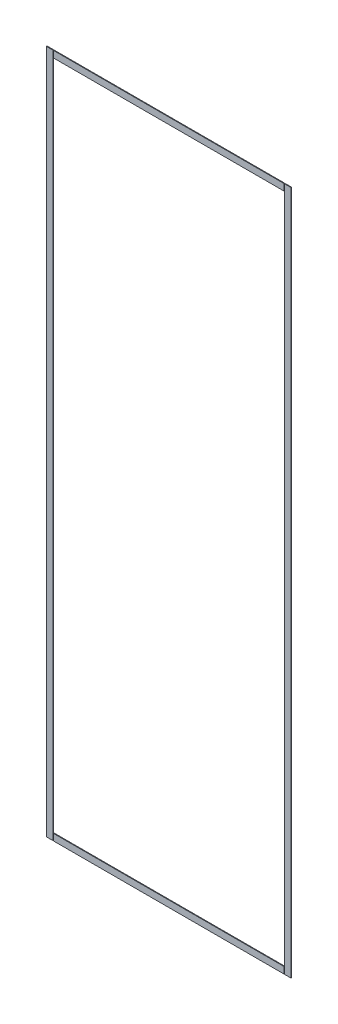
ISO-10303-21;
HEADER;
FILE_DESCRIPTION(('STEP AP214'),'2;1');
FILE_NAME('part.step','',(''),(''),'','','');
FILE_SCHEMA(('AUTOMOTIVE_DESIGN { 1 0 10303 214 1 1 1 1 }'));
ENDSEC;
DATA;
#1=APPLICATION_CONTEXT('core data for automotive mechanical design processes');
#2=APPLICATION_PROTOCOL_DEFINITION('international standard','automotive_design',2000,#1);
#3=PRODUCT_CONTEXT('',#1,'mechanical');
#4=PRODUCT('Part','Part','',(#3));
#5=PRODUCT_RELATED_PRODUCT_CATEGORY('part','',(#4));
#6=PRODUCT_DEFINITION_FORMATION('','',#4);
#7=PRODUCT_DEFINITION_CONTEXT('part definition',#1,'design');
#8=PRODUCT_DEFINITION('design','',#6,#7);
#9=PRODUCT_DEFINITION_SHAPE('','',#8);
#10=(LENGTH_UNIT() NAMED_UNIT(*) SI_UNIT(.MILLI.,.METRE.));
#11=(NAMED_UNIT(*) PLANE_ANGLE_UNIT() SI_UNIT($,.RADIAN.));
#12=(NAMED_UNIT(*) SI_UNIT($,.STERADIAN.) SOLID_ANGLE_UNIT());
#13=UNCERTAINTY_MEASURE_WITH_UNIT(LENGTH_MEASURE(1.E-05),#10,'distance_accuracy_value','');
#14=(GEOMETRIC_REPRESENTATION_CONTEXT(3) GLOBAL_UNCERTAINTY_ASSIGNED_CONTEXT((#13)) GLOBAL_UNIT_ASSIGNED_CONTEXT((#10,
#11,#12)) REPRESENTATION_CONTEXT('',''));
#15=CARTESIAN_POINT('',(0.,0.,0.));
#16=DIRECTION('',(0.,0.,1.));
#17=DIRECTION('',(1.,0.,0.));
#18=AXIS2_PLACEMENT_3D('',#15,#16,#17);
#19=CARTESIAN_POINT('',(0.,0.,-1.));
#20=DIRECTION('',(0.,0.,-1.));
#21=DIRECTION('',(-1.,0.,0.));
#22=AXIS2_PLACEMENT_3D('',#19,#20,#21);
#23=PLANE('',#22);
#24=DIRECTION('',(0.,1.,0.));
#25=VECTOR('',#24,1.);
#26=CARTESIAN_POINT('',(-352.,-1110.,-1.));
#27=LINE('',#26,#25);
#28=CARTESIAN_POINT('',(-352.,-1110.,-1.));
#29=VERTEX_POINT('',#28);
#30=CARTESIAN_POINT('',(-352.,-1090.,-1.));
#31=VERTEX_POINT('',#30);
#32=EDGE_CURVE('E56',#29,#31,#27,.T.);
#33=ORIENTED_EDGE('',*,*,#32,.T.);
#34=DIRECTION('',(1.,0.,0.));
#35=VECTOR('',#34,1.);
#36=CARTESIAN_POINT('',(-352.,-1090.,-1.));
#37=LINE('',#36,#35);
#38=CARTESIAN_POINT('',(352.,-1090.,-1.));
#39=VERTEX_POINT('',#38);
#40=EDGE_CURVE('E95',#31,#39,#37,.T.);
#41=ORIENTED_EDGE('',*,*,#40,.T.);
#42=DIRECTION('',(0.,-1.,0.));
#43=VECTOR('',#42,1.);
#44=CARTESIAN_POINT('',(352.,-1110.,-1.));
#45=LINE('',#44,#43);
#46=CARTESIAN_POINT('',(352.,-1110.,-1.));
#47=VERTEX_POINT('',#46);
#48=EDGE_CURVE('E90',#39,#47,#45,.T.);
#49=ORIENTED_EDGE('',*,*,#48,.T.);
#50=DIRECTION('',(1.,0.,0.));
#51=VECTOR('',#50,1.);
#52=CARTESIAN_POINT('',(-352.,-1110.,-1.));
#53=LINE('',#52,#51);
#54=EDGE_CURVE('E106',#47,#29,#53,.F.);
#55=ORIENTED_EDGE('',*,*,#54,.T.);
#56=EDGE_LOOP('',(#33,#41,#49,#55));
#57=FACE_BOUND('',#56,.T.);
#58=ADVANCED_FACE('F53',(#57),#23,.T.);
#59=CARTESIAN_POINT('',(-352.,-1110.,1.));
#60=DIRECTION('',(1.,0.,0.));
#61=DIRECTION('',(0.,1.,0.));
#62=AXIS2_PLACEMENT_3D('',#59,#60,#61);
#63=PLANE('',#62);
#64=DIRECTION('',(0.,1.,0.));
#65=VECTOR('',#64,1.);
#66=CARTESIAN_POINT('',(-352.,0.,1.));
#67=LINE('',#66,#65);
#68=CARTESIAN_POINT('',(-352.,-1110.,1.));
#69=VERTEX_POINT('',#68);
#70=CARTESIAN_POINT('',(-352.,-1090.,1.));
#71=VERTEX_POINT('',#70);
#72=EDGE_CURVE('E113',#69,#71,#67,.T.);
#73=ORIENTED_EDGE('',*,*,#72,.T.);
#74=DIRECTION('',(0.,0.,-1.));
#75=VECTOR('',#74,1.);
#76=CARTESIAN_POINT('',(-352.,-1090.,1.));
#77=LINE('',#76,#75);
#78=EDGE_CURVE('E100',#71,#31,#77,.T.);
#79=ORIENTED_EDGE('',*,*,#78,.T.);
#80=ORIENTED_EDGE('',*,*,#32,.F.);
#81=DIRECTION('',(0.,0.,1.));
#82=VECTOR('',#81,1.);
#83=CARTESIAN_POINT('',(-352.,-1110.,1.));
#84=LINE('',#83,#82);
#85=EDGE_CURVE('E123',#29,#69,#84,.T.);
#86=ORIENTED_EDGE('',*,*,#85,.T.);
#87=EDGE_LOOP('',(#73,#79,#80,#86));
#88=FACE_BOUND('',#87,.T.);
#89=ADVANCED_FACE('F112',(#88),#63,.F.);
#90=CARTESIAN_POINT('',(-352.,-1090.,1.));
#91=DIRECTION('',(0.,-1.,0.));
#92=DIRECTION('',(0.,0.,-1.));
#93=AXIS2_PLACEMENT_3D('',#90,#91,#92);
#94=PLANE('',#93);
#95=DIRECTION('',(-1.,0.,0.));
#96=VECTOR('',#95,1.);
#97=CARTESIAN_POINT('',(0.,-1090.,1.));
#98=LINE('',#97,#96);
#99=CARTESIAN_POINT('',(352.,-1090.,1.));
#100=VERTEX_POINT('',#99);
#101=EDGE_CURVE('E130',#71,#100,#98,.F.);
#102=ORIENTED_EDGE('',*,*,#101,.T.);
#103=DIRECTION('',(0.,0.,1.));
#104=VECTOR('',#103,1.);
#105=CARTESIAN_POINT('',(352.,-1090.,1.));
#106=LINE('',#105,#104);
#107=EDGE_CURVE('E102',#100,#39,#106,.F.);
#108=ORIENTED_EDGE('',*,*,#107,.T.);
#109=ORIENTED_EDGE('',*,*,#40,.F.);
#110=ORIENTED_EDGE('',*,*,#78,.F.);
#111=EDGE_LOOP('',(#102,#108,#109,#110));
#112=FACE_BOUND('',#111,.T.);
#113=ADVANCED_FACE('F98',(#112),#94,.F.);
#114=CARTESIAN_POINT('',(352.,-1110.,1.));
#115=DIRECTION('',(-1.,0.,0.));
#116=DIRECTION('',(0.,-1.,0.));
#117=AXIS2_PLACEMENT_3D('',#114,#115,#116);
#118=PLANE('',#117);
#119=DIRECTION('',(0.,1.,0.));
#120=VECTOR('',#119,1.);
#121=CARTESIAN_POINT('',(352.,0.,1.));
#122=LINE('',#121,#120);
#123=CARTESIAN_POINT('',(352.,-1110.,1.));
#124=VERTEX_POINT('',#123);
#125=EDGE_CURVE('E63',#100,#124,#122,.F.);
#126=ORIENTED_EDGE('',*,*,#125,.T.);
#127=DIRECTION('',(0.,0.,1.));
#128=VECTOR('',#127,1.);
#129=CARTESIAN_POINT('',(352.,-1110.,1.));
#130=LINE('',#129,#128);
#131=EDGE_CURVE('E71',#124,#47,#130,.F.);
#132=ORIENTED_EDGE('',*,*,#131,.T.);
#133=ORIENTED_EDGE('',*,*,#48,.F.);
#134=ORIENTED_EDGE('',*,*,#107,.F.);
#135=EDGE_LOOP('',(#126,#132,#133,#134));
#136=FACE_BOUND('',#135,.T.);
#137=ADVANCED_FACE('F136',(#136),#118,.F.);
#138=CARTESIAN_POINT('',(-352.,-1110.,1.));
#139=DIRECTION('',(0.,1.,0.));
#140=DIRECTION('',(0.,0.,1.));
#141=AXIS2_PLACEMENT_3D('',#138,#139,#140);
#142=PLANE('',#141);
#143=DIRECTION('',(-1.,0.,0.));
#144=VECTOR('',#143,1.);
#145=CARTESIAN_POINT('',(0.,-1110.,1.));
#146=LINE('',#145,#144);
#147=EDGE_CURVE('E12',#124,#69,#146,.T.);
#148=ORIENTED_EDGE('',*,*,#147,.T.);
#149=ORIENTED_EDGE('',*,*,#85,.F.);
#150=ORIENTED_EDGE('',*,*,#54,.F.);
#151=ORIENTED_EDGE('',*,*,#131,.F.);
#152=EDGE_LOOP('',(#148,#149,#150,#151));
#153=FACE_BOUND('',#152,.T.);
#154=ADVANCED_FACE('F139',(#153),#142,.F.);
#155=CARTESIAN_POINT('',(0.,0.,1.));
#156=DIRECTION('',(0.,0.,-1.));
#157=DIRECTION('',(-1.,0.,0.));
#158=AXIS2_PLACEMENT_3D('',#155,#156,#157);
#159=PLANE('',#158);
#160=ORIENTED_EDGE('',*,*,#125,.F.);
#161=ORIENTED_EDGE('',*,*,#101,.F.);
#162=ORIENTED_EDGE('',*,*,#72,.F.);
#163=ORIENTED_EDGE('',*,*,#147,.F.);
#164=EDGE_LOOP('',(#160,#161,#162,#163));
#165=FACE_BOUND('',#164,.T.);
#166=ADVANCED_FACE('F138',(#165),#159,.F.);
#167=CLOSED_SHELL('',(#58,#89,#113,#137,#154,#166));
#168=MANIFOLD_SOLID_BREP('B2',#167);
#169=CARTESIAN_POINT('',(0.,0.,-1.));
#170=DIRECTION('',(0.,0.,1.));
#171=DIRECTION('',(1.,0.,0.));
#172=AXIS2_PLACEMENT_3D('',#169,#170,#171);
#173=PLANE('',#172);
#174=DIRECTION('',(0.,-1.,0.));
#175=VECTOR('',#174,1.);
#176=CARTESIAN_POINT('',(352.,980.,-1.));
#177=LINE('',#176,#175);
#178=CARTESIAN_POINT('',(352.,980.,-1.));
#179=VERTEX_POINT('',#178);
#180=CARTESIAN_POINT('',(352.,960.000000000001,-1.));
#181=VERTEX_POINT('',#180);
#182=EDGE_CURVE('E229',#179,#181,#177,.T.);
#183=ORIENTED_EDGE('',*,*,#182,.T.);
#184=DIRECTION('',(1.,0.,0.));
#185=VECTOR('',#184,1.);
#186=CARTESIAN_POINT('',(-352.,960.000000000001,-1.));
#187=LINE('',#186,#185);
#188=CARTESIAN_POINT('',(-352.,960.000000000001,-1.));
#189=VERTEX_POINT('',#188);
#190=EDGE_CURVE('E288',#181,#189,#187,.F.);
#191=ORIENTED_EDGE('',*,*,#190,.T.);
#192=DIRECTION('',(0.,1.,0.));
#193=VECTOR('',#192,1.);
#194=CARTESIAN_POINT('',(-352.,980.,-1.));
#195=LINE('',#194,#193);
#196=CARTESIAN_POINT('',(-352.,980.,-1.));
#197=VERTEX_POINT('',#196);
#198=EDGE_CURVE('E264',#189,#197,#195,.T.);
#199=ORIENTED_EDGE('',*,*,#198,.T.);
#200=DIRECTION('',(1.,0.,0.));
#201=VECTOR('',#200,1.);
#202=CARTESIAN_POINT('',(-352.,980.,-1.));
#203=LINE('',#202,#201);
#204=EDGE_CURVE('E266',#197,#179,#203,.T.);
#205=ORIENTED_EDGE('',*,*,#204,.T.);
#206=EDGE_LOOP('',(#183,#191,#199,#205));
#207=FACE_BOUND('',#206,.T.);
#208=ADVANCED_FACE('F226',(#207),#173,.F.);
#209=CARTESIAN_POINT('',(352.,980.,1.));
#210=DIRECTION('',(-1.,0.,0.));
#211=DIRECTION('',(0.,-1.,0.));
#212=AXIS2_PLACEMENT_3D('',#209,#210,#211);
#213=PLANE('',#212);
#214=DIRECTION('',(0.,1.,0.));
#215=VECTOR('',#214,1.);
#216=CARTESIAN_POINT('',(352.,0.,1.));
#217=LINE('',#216,#215);
#218=CARTESIAN_POINT('',(352.,960.000000000001,1.));
#219=VERTEX_POINT('',#218);
#220=CARTESIAN_POINT('',(352.,980.,1.));
#221=VERTEX_POINT('',#220);
#222=EDGE_CURVE('E292',#219,#221,#217,.T.);
#223=ORIENTED_EDGE('',*,*,#222,.F.);
#224=DIRECTION('',(0.,0.,1.));
#225=VECTOR('',#224,1.);
#226=CARTESIAN_POINT('',(352.,960.000000000001,1.));
#227=LINE('',#226,#225);
#228=EDGE_CURVE('E277',#219,#181,#227,.F.);
#229=ORIENTED_EDGE('',*,*,#228,.T.);
#230=ORIENTED_EDGE('',*,*,#182,.F.);
#231=DIRECTION('',(0.,0.,-1.));
#232=VECTOR('',#231,1.);
#233=CARTESIAN_POINT('',(352.,980.,1.));
#234=LINE('',#233,#232);
#235=EDGE_CURVE('E272',#179,#221,#234,.F.);
#236=ORIENTED_EDGE('',*,*,#235,.T.);
#237=EDGE_LOOP('',(#223,#229,#230,#236));
#238=FACE_BOUND('',#237,.T.);
#239=ADVANCED_FACE('F274',(#238),#213,.F.);
#240=CARTESIAN_POINT('',(-352.,980.,1.));
#241=DIRECTION('',(0.,-1.,0.));
#242=DIRECTION('',(0.,0.,-1.));
#243=AXIS2_PLACEMENT_3D('',#240,#241,#242);
#244=PLANE('',#243);
#245=DIRECTION('',(1.,0.,0.));
#246=VECTOR('',#245,1.);
#247=CARTESIAN_POINT('',(0.,980.,1.));
#248=LINE('',#247,#246);
#249=CARTESIAN_POINT('',(-352.,980.,1.));
#250=VERTEX_POINT('',#249);
#251=EDGE_CURVE('E281',#221,#250,#248,.F.);
#252=ORIENTED_EDGE('',*,*,#251,.F.);
#253=ORIENTED_EDGE('',*,*,#235,.F.);
#254=ORIENTED_EDGE('',*,*,#204,.F.);
#255=DIRECTION('',(0.,0.,1.));
#256=VECTOR('',#255,1.);
#257=CARTESIAN_POINT('',(-352.,980.,1.));
#258=LINE('',#257,#256);
#259=EDGE_CURVE('E284',#197,#250,#258,.T.);
#260=ORIENTED_EDGE('',*,*,#259,.T.);
#261=EDGE_LOOP('',(#252,#253,#254,#260));
#262=FACE_BOUND('',#261,.T.);
#263=ADVANCED_FACE('F279',(#262),#244,.F.);
#264=CARTESIAN_POINT('',(-352.,980.,1.));
#265=DIRECTION('',(1.,0.,0.));
#266=DIRECTION('',(0.,1.,0.));
#267=AXIS2_PLACEMENT_3D('',#264,#265,#266);
#268=PLANE('',#267);
#269=DIRECTION('',(0.,1.,0.));
#270=VECTOR('',#269,1.);
#271=CARTESIAN_POINT('',(-352.,0.,1.));
#272=LINE('',#271,#270);
#273=CARTESIAN_POINT('',(-352.,960.000000000001,1.));
#274=VERTEX_POINT('',#273);
#275=EDGE_CURVE('E235',#250,#274,#272,.F.);
#276=ORIENTED_EDGE('',*,*,#275,.F.);
#277=ORIENTED_EDGE('',*,*,#259,.F.);
#278=ORIENTED_EDGE('',*,*,#198,.F.);
#279=DIRECTION('',(0.,0.,1.));
#280=VECTOR('',#279,1.);
#281=CARTESIAN_POINT('',(-352.,960.000000000001,1.));
#282=LINE('',#281,#280);
#283=EDGE_CURVE('E244',#189,#274,#282,.T.);
#284=ORIENTED_EDGE('',*,*,#283,.T.);
#285=EDGE_LOOP('',(#276,#277,#278,#284));
#286=FACE_BOUND('',#285,.T.);
#287=ADVANCED_FACE('F298',(#286),#268,.F.);
#288=CARTESIAN_POINT('',(-352.,960.000000000001,1.));
#289=DIRECTION('',(0.,1.,0.));
#290=DIRECTION('',(0.,0.,1.));
#291=AXIS2_PLACEMENT_3D('',#288,#289,#290);
#292=PLANE('',#291);
#293=DIRECTION('',(1.,0.,0.));
#294=VECTOR('',#293,1.);
#295=CARTESIAN_POINT('',(0.,960.000000000001,1.));
#296=LINE('',#295,#294);
#297=EDGE_CURVE('E51',#274,#219,#296,.T.);
#298=ORIENTED_EDGE('',*,*,#297,.F.);
#299=ORIENTED_EDGE('',*,*,#283,.F.);
#300=ORIENTED_EDGE('',*,*,#190,.F.);
#301=ORIENTED_EDGE('',*,*,#228,.F.);
#302=EDGE_LOOP('',(#298,#299,#300,#301));
#303=FACE_BOUND('',#302,.T.);
#304=ADVANCED_FACE('F300',(#303),#292,.F.);
#305=CARTESIAN_POINT('',(0.,0.,1.));
#306=DIRECTION('',(0.,0.,1.));
#307=DIRECTION('',(1.,0.,0.));
#308=AXIS2_PLACEMENT_3D('',#305,#306,#307);
#309=PLANE('',#308);
#310=ORIENTED_EDGE('',*,*,#275,.T.);
#311=ORIENTED_EDGE('',*,*,#297,.T.);
#312=ORIENTED_EDGE('',*,*,#222,.T.);
#313=ORIENTED_EDGE('',*,*,#251,.T.);
#314=EDGE_LOOP('',(#310,#311,#312,#313));
#315=FACE_BOUND('',#314,.T.);
#316=ADVANCED_FACE('F297',(#315),#309,.T.);
#317=CLOSED_SHELL('',(#208,#239,#263,#287,#304,#316));
#318=MANIFOLD_SOLID_BREP('B6',#317);
#319=CARTESIAN_POINT('',(0.,0.,-1.));
#320=DIRECTION('',(0.,0.,1.));
#321=DIRECTION('',(1.,0.,0.));
#322=AXIS2_PLACEMENT_3D('',#319,#320,#321);
#323=PLANE('',#322);
#324=DIRECTION('',(0.,1.,0.));
#325=VECTOR('',#324,1.);
#326=CARTESIAN_POINT('',(353.,980.,-1.));
#327=LINE('',#326,#325);
#328=CARTESIAN_POINT('',(353.,-1110.,-1.));
#329=VERTEX_POINT('',#328);
#330=CARTESIAN_POINT('',(353.,980.,-1.));
#331=VERTEX_POINT('',#330);
#332=EDGE_CURVE('E387',#329,#331,#327,.T.);
#333=ORIENTED_EDGE('',*,*,#332,.T.);
#334=DIRECTION('',(1.,0.,0.));
#335=VECTOR('',#334,1.);
#336=CARTESIAN_POINT('',(353.,980.,-1.));
#337=LINE('',#336,#335);
#338=CARTESIAN_POINT('',(373.,980.,-1.));
#339=VERTEX_POINT('',#338);
#340=EDGE_CURVE('E446',#331,#339,#337,.T.);
#341=ORIENTED_EDGE('',*,*,#340,.T.);
#342=DIRECTION('',(0.,-1.,0.));
#343=VECTOR('',#342,1.);
#344=CARTESIAN_POINT('',(373.,980.,-1.));
#345=LINE('',#344,#343);
#346=CARTESIAN_POINT('',(373.,-1110.,-1.));
#347=VERTEX_POINT('',#346);
#348=EDGE_CURVE('E422',#339,#347,#345,.T.);
#349=ORIENTED_EDGE('',*,*,#348,.T.);
#350=DIRECTION('',(1.,0.,0.));
#351=VECTOR('',#350,1.);
#352=CARTESIAN_POINT('',(353.,-1110.,-1.));
#353=LINE('',#352,#351);
#354=EDGE_CURVE('E424',#347,#329,#353,.F.);
#355=ORIENTED_EDGE('',*,*,#354,.T.);
#356=EDGE_LOOP('',(#333,#341,#349,#355));
#357=FACE_BOUND('',#356,.T.);
#358=ADVANCED_FACE('F384',(#357),#323,.F.);
#359=CARTESIAN_POINT('',(353.,980.,1.));
#360=DIRECTION('',(1.,0.,0.));
#361=DIRECTION('',(0.,1.,0.));
#362=AXIS2_PLACEMENT_3D('',#359,#360,#361);
#363=PLANE('',#362);
#364=DIRECTION('',(0.,1.,0.));
#365=VECTOR('',#364,1.);
#366=CARTESIAN_POINT('',(353.,0.,1.));
#367=LINE('',#366,#365);
#368=CARTESIAN_POINT('',(353.,980.,1.));
#369=VERTEX_POINT('',#368);
#370=CARTESIAN_POINT('',(353.,-1110.,1.));
#371=VERTEX_POINT('',#370);
#372=EDGE_CURVE('E450',#369,#371,#367,.F.);
#373=ORIENTED_EDGE('',*,*,#372,.F.);
#374=DIRECTION('',(0.,0.,-1.));
#375=VECTOR('',#374,1.);
#376=CARTESIAN_POINT('',(353.,980.,1.));
#377=LINE('',#376,#375);
#378=EDGE_CURVE('E435',#369,#331,#377,.T.);
#379=ORIENTED_EDGE('',*,*,#378,.T.);
#380=ORIENTED_EDGE('',*,*,#332,.F.);
#381=DIRECTION('',(0.,0.,1.));
#382=VECTOR('',#381,1.);
#383=CARTESIAN_POINT('',(353.,-1110.,1.));
#384=LINE('',#383,#382);
#385=EDGE_CURVE('E430',#329,#371,#384,.T.);
#386=ORIENTED_EDGE('',*,*,#385,.T.);
#387=EDGE_LOOP('',(#373,#379,#380,#386));
#388=FACE_BOUND('',#387,.T.);
#389=ADVANCED_FACE('F432',(#388),#363,.F.);
#390=CARTESIAN_POINT('',(353.,-1110.,1.));
#391=DIRECTION('',(0.,1.,0.));
#392=DIRECTION('',(0.,0.,1.));
#393=AXIS2_PLACEMENT_3D('',#390,#391,#392);
#394=PLANE('',#393);
#395=DIRECTION('',(1.,0.,0.));
#396=VECTOR('',#395,1.);
#397=CARTESIAN_POINT('',(0.,-1110.,1.));
#398=LINE('',#397,#396);
#399=CARTESIAN_POINT('',(373.,-1110.,1.));
#400=VERTEX_POINT('',#399);
#401=EDGE_CURVE('E439',#371,#400,#398,.T.);
#402=ORIENTED_EDGE('',*,*,#401,.F.);
#403=ORIENTED_EDGE('',*,*,#385,.F.);
#404=ORIENTED_EDGE('',*,*,#354,.F.);
#405=DIRECTION('',(0.,0.,1.));
#406=VECTOR('',#405,1.);
#407=CARTESIAN_POINT('',(373.,-1110.,1.));
#408=LINE('',#407,#406);
#409=EDGE_CURVE('E442',#347,#400,#408,.T.);
#410=ORIENTED_EDGE('',*,*,#409,.T.);
#411=EDGE_LOOP('',(#402,#403,#404,#410));
#412=FACE_BOUND('',#411,.T.);
#413=ADVANCED_FACE('F437',(#412),#394,.F.);
#414=CARTESIAN_POINT('',(373.,980.,1.));
#415=DIRECTION('',(-1.,0.,0.));
#416=DIRECTION('',(0.,-1.,0.));
#417=AXIS2_PLACEMENT_3D('',#414,#415,#416);
#418=PLANE('',#417);
#419=DIRECTION('',(0.,1.,0.));
#420=VECTOR('',#419,1.);
#421=CARTESIAN_POINT('',(373.,0.,1.));
#422=LINE('',#421,#420);
#423=CARTESIAN_POINT('',(373.,980.,1.));
#424=VERTEX_POINT('',#423);
#425=EDGE_CURVE('E393',#400,#424,#422,.T.);
#426=ORIENTED_EDGE('',*,*,#425,.F.);
#427=ORIENTED_EDGE('',*,*,#409,.F.);
#428=ORIENTED_EDGE('',*,*,#348,.F.);
#429=DIRECTION('',(0.,0.,-1.));
#430=VECTOR('',#429,1.);
#431=CARTESIAN_POINT('',(373.,980.,1.));
#432=LINE('',#431,#430);
#433=EDGE_CURVE('E402',#339,#424,#432,.F.);
#434=ORIENTED_EDGE('',*,*,#433,.T.);
#435=EDGE_LOOP('',(#426,#427,#428,#434));
#436=FACE_BOUND('',#435,.T.);
#437=ADVANCED_FACE('F456',(#436),#418,.F.);
#438=CARTESIAN_POINT('',(353.,980.,1.));
#439=DIRECTION('',(0.,-1.,0.));
#440=DIRECTION('',(0.,0.,-1.));
#441=AXIS2_PLACEMENT_3D('',#438,#439,#440);
#442=PLANE('',#441);
#443=DIRECTION('',(1.,0.,0.));
#444=VECTOR('',#443,1.);
#445=CARTESIAN_POINT('',(0.,980.,1.));
#446=LINE('',#445,#444);
#447=EDGE_CURVE('E224',#424,#369,#446,.F.);
#448=ORIENTED_EDGE('',*,*,#447,.F.);
#449=ORIENTED_EDGE('',*,*,#433,.F.);
#450=ORIENTED_EDGE('',*,*,#340,.F.);
#451=ORIENTED_EDGE('',*,*,#378,.F.);
#452=EDGE_LOOP('',(#448,#449,#450,#451));
#453=FACE_BOUND('',#452,.T.);
#454=ADVANCED_FACE('F458',(#453),#442,.F.);
#455=CARTESIAN_POINT('',(0.,0.,1.));
#456=DIRECTION('',(0.,0.,1.));
#457=DIRECTION('',(1.,0.,0.));
#458=AXIS2_PLACEMENT_3D('',#455,#456,#457);
#459=PLANE('',#458);
#460=ORIENTED_EDGE('',*,*,#425,.T.);
#461=ORIENTED_EDGE('',*,*,#447,.T.);
#462=ORIENTED_EDGE('',*,*,#372,.T.);
#463=ORIENTED_EDGE('',*,*,#401,.T.);
#464=EDGE_LOOP('',(#460,#461,#462,#463));
#465=FACE_BOUND('',#464,.T.);
#466=ADVANCED_FACE('F455',(#465),#459,.T.);
#467=CLOSED_SHELL('',(#358,#389,#413,#437,#454,#466));
#468=MANIFOLD_SOLID_BREP('B45',#467);
#469=CARTESIAN_POINT('',(0.,0.,-1.));
#470=DIRECTION('',(0.,0.,1.));
#471=DIRECTION('',(1.,0.,0.));
#472=AXIS2_PLACEMENT_3D('',#469,#470,#471);
#473=PLANE('',#472);
#474=DIRECTION('',(0.,1.,0.));
#475=VECTOR('',#474,1.);
#476=CARTESIAN_POINT('',(-373.,980.,-1.));
#477=LINE('',#476,#475);
#478=CARTESIAN_POINT('',(-373.,-1110.,-1.));
#479=VERTEX_POINT('',#478);
#480=CARTESIAN_POINT('',(-373.,980.,-1.));
#481=VERTEX_POINT('',#480);
#482=EDGE_CURVE('E536',#479,#481,#477,.T.);
#483=ORIENTED_EDGE('',*,*,#482,.T.);
#484=DIRECTION('',(1.,0.,0.));
#485=VECTOR('',#484,1.);
#486=CARTESIAN_POINT('',(-373.,980.,-1.));
#487=LINE('',#486,#485);
#488=CARTESIAN_POINT('',(-353.,980.,-1.));
#489=VERTEX_POINT('',#488);
#490=EDGE_CURVE('E595',#481,#489,#487,.T.);
#491=ORIENTED_EDGE('',*,*,#490,.T.);
#492=DIRECTION('',(0.,-1.,0.));
#493=VECTOR('',#492,1.);
#494=CARTESIAN_POINT('',(-353.,980.,-1.));
#495=LINE('',#494,#493);
#496=CARTESIAN_POINT('',(-353.,-1110.,-1.));
#497=VERTEX_POINT('',#496);
#498=EDGE_CURVE('E571',#489,#497,#495,.T.);
#499=ORIENTED_EDGE('',*,*,#498,.T.);
#500=DIRECTION('',(1.,0.,0.));
#501=VECTOR('',#500,1.);
#502=CARTESIAN_POINT('',(-373.,-1110.,-1.));
#503=LINE('',#502,#501);
#504=EDGE_CURVE('E573',#497,#479,#503,.F.);
#505=ORIENTED_EDGE('',*,*,#504,.T.);
#506=EDGE_LOOP('',(#483,#491,#499,#505));
#507=FACE_BOUND('',#506,.T.);
#508=ADVANCED_FACE('F533',(#507),#473,.F.);
#509=CARTESIAN_POINT('',(-373.,980.,1.));
#510=DIRECTION('',(1.,0.,0.));
#511=DIRECTION('',(0.,1.,0.));
#512=AXIS2_PLACEMENT_3D('',#509,#510,#511);
#513=PLANE('',#512);
#514=DIRECTION('',(0.,1.,0.));
#515=VECTOR('',#514,1.);
#516=CARTESIAN_POINT('',(-373.,0.,1.));
#517=LINE('',#516,#515);
#518=CARTESIAN_POINT('',(-373.,980.,1.));
#519=VERTEX_POINT('',#518);
#520=CARTESIAN_POINT('',(-373.,-1110.,1.));
#521=VERTEX_POINT('',#520);
#522=EDGE_CURVE('E599',#519,#521,#517,.F.);
#523=ORIENTED_EDGE('',*,*,#522,.F.);
#524=DIRECTION('',(0.,0.,-1.));
#525=VECTOR('',#524,1.);
#526=CARTESIAN_POINT('',(-373.,980.,1.));
#527=LINE('',#526,#525);
#528=EDGE_CURVE('E584',#519,#481,#527,.T.);
#529=ORIENTED_EDGE('',*,*,#528,.T.);
#530=ORIENTED_EDGE('',*,*,#482,.F.);
#531=DIRECTION('',(0.,0.,1.));
#532=VECTOR('',#531,1.);
#533=CARTESIAN_POINT('',(-373.,-1110.,1.));
#534=LINE('',#533,#532);
#535=EDGE_CURVE('E579',#479,#521,#534,.T.);
#536=ORIENTED_EDGE('',*,*,#535,.T.);
#537=EDGE_LOOP('',(#523,#529,#530,#536));
#538=FACE_BOUND('',#537,.T.);
#539=ADVANCED_FACE('F581',(#538),#513,.F.);
#540=CARTESIAN_POINT('',(-373.,-1110.,1.));
#541=DIRECTION('',(0.,1.,0.));
#542=DIRECTION('',(0.,0.,1.));
#543=AXIS2_PLACEMENT_3D('',#540,#541,#542);
#544=PLANE('',#543);
#545=DIRECTION('',(1.,0.,0.));
#546=VECTOR('',#545,1.);
#547=CARTESIAN_POINT('',(0.,-1110.,1.));
#548=LINE('',#547,#546);
#549=CARTESIAN_POINT('',(-353.,-1110.,1.));
#550=VERTEX_POINT('',#549);
#551=EDGE_CURVE('E588',#521,#550,#548,.T.);
#552=ORIENTED_EDGE('',*,*,#551,.F.);
#553=ORIENTED_EDGE('',*,*,#535,.F.);
#554=ORIENTED_EDGE('',*,*,#504,.F.);
#555=DIRECTION('',(0.,0.,1.));
#556=VECTOR('',#555,1.);
#557=CARTESIAN_POINT('',(-353.,-1110.,1.));
#558=LINE('',#557,#556);
#559=EDGE_CURVE('E591',#497,#550,#558,.T.);
#560=ORIENTED_EDGE('',*,*,#559,.T.);
#561=EDGE_LOOP('',(#552,#553,#554,#560));
#562=FACE_BOUND('',#561,.T.);
#563=ADVANCED_FACE('F586',(#562),#544,.F.);
#564=CARTESIAN_POINT('',(-353.,980.,1.));
#565=DIRECTION('',(-1.,0.,0.));
#566=DIRECTION('',(0.,-1.,0.));
#567=AXIS2_PLACEMENT_3D('',#564,#565,#566);
#568=PLANE('',#567);
#569=DIRECTION('',(0.,1.,0.));
#570=VECTOR('',#569,1.);
#571=CARTESIAN_POINT('',(-353.,0.,1.));
#572=LINE('',#571,#570);
#573=CARTESIAN_POINT('',(-353.,980.,1.));
#574=VERTEX_POINT('',#573);
#575=EDGE_CURVE('E542',#550,#574,#572,.T.);
#576=ORIENTED_EDGE('',*,*,#575,.F.);
#577=ORIENTED_EDGE('',*,*,#559,.F.);
#578=ORIENTED_EDGE('',*,*,#498,.F.);
#579=DIRECTION('',(0.,0.,-1.));
#580=VECTOR('',#579,1.);
#581=CARTESIAN_POINT('',(-353.,980.,1.));
#582=LINE('',#581,#580);
#583=EDGE_CURVE('E551',#489,#574,#582,.F.);
#584=ORIENTED_EDGE('',*,*,#583,.T.);
#585=EDGE_LOOP('',(#576,#577,#578,#584));
#586=FACE_BOUND('',#585,.T.);
#587=ADVANCED_FACE('F605',(#586),#568,.F.);
#588=CARTESIAN_POINT('',(-373.,980.,1.));
#589=DIRECTION('',(0.,-1.,0.));
#590=DIRECTION('',(0.,0.,-1.));
#591=AXIS2_PLACEMENT_3D('',#588,#589,#590);
#592=PLANE('',#591);
#593=DIRECTION('',(1.,0.,0.));
#594=VECTOR('',#593,1.);
#595=CARTESIAN_POINT('',(0.,980.,1.));
#596=LINE('',#595,#594);
#597=EDGE_CURVE('E382',#574,#519,#596,.F.);
#598=ORIENTED_EDGE('',*,*,#597,.F.);
#599=ORIENTED_EDGE('',*,*,#583,.F.);
#600=ORIENTED_EDGE('',*,*,#490,.F.);
#601=ORIENTED_EDGE('',*,*,#528,.F.);
#602=EDGE_LOOP('',(#598,#599,#600,#601));
#603=FACE_BOUND('',#602,.T.);
#604=ADVANCED_FACE('F607',(#603),#592,.F.);
#605=CARTESIAN_POINT('',(0.,0.,1.));
#606=DIRECTION('',(0.,0.,1.));
#607=DIRECTION('',(1.,0.,0.));
#608=AXIS2_PLACEMENT_3D('',#605,#606,#607);
#609=PLANE('',#608);
#610=ORIENTED_EDGE('',*,*,#575,.T.);
#611=ORIENTED_EDGE('',*,*,#597,.T.);
#612=ORIENTED_EDGE('',*,*,#522,.T.);
#613=ORIENTED_EDGE('',*,*,#551,.T.);
#614=EDGE_LOOP('',(#610,#611,#612,#613));
#615=FACE_BOUND('',#614,.T.);
#616=ADVANCED_FACE('F604',(#615),#609,.T.);
#617=CLOSED_SHELL('',(#508,#539,#563,#587,#604,#616));
#618=MANIFOLD_SOLID_BREP('B218',#617);
#619=ADVANCED_BREP_SHAPE_REPRESENTATION('',(#18,#168,#318,#468,#618),#14);
#620=SHAPE_DEFINITION_REPRESENTATION(#9,#619);
ENDSEC;
END-ISO-10303-21;
